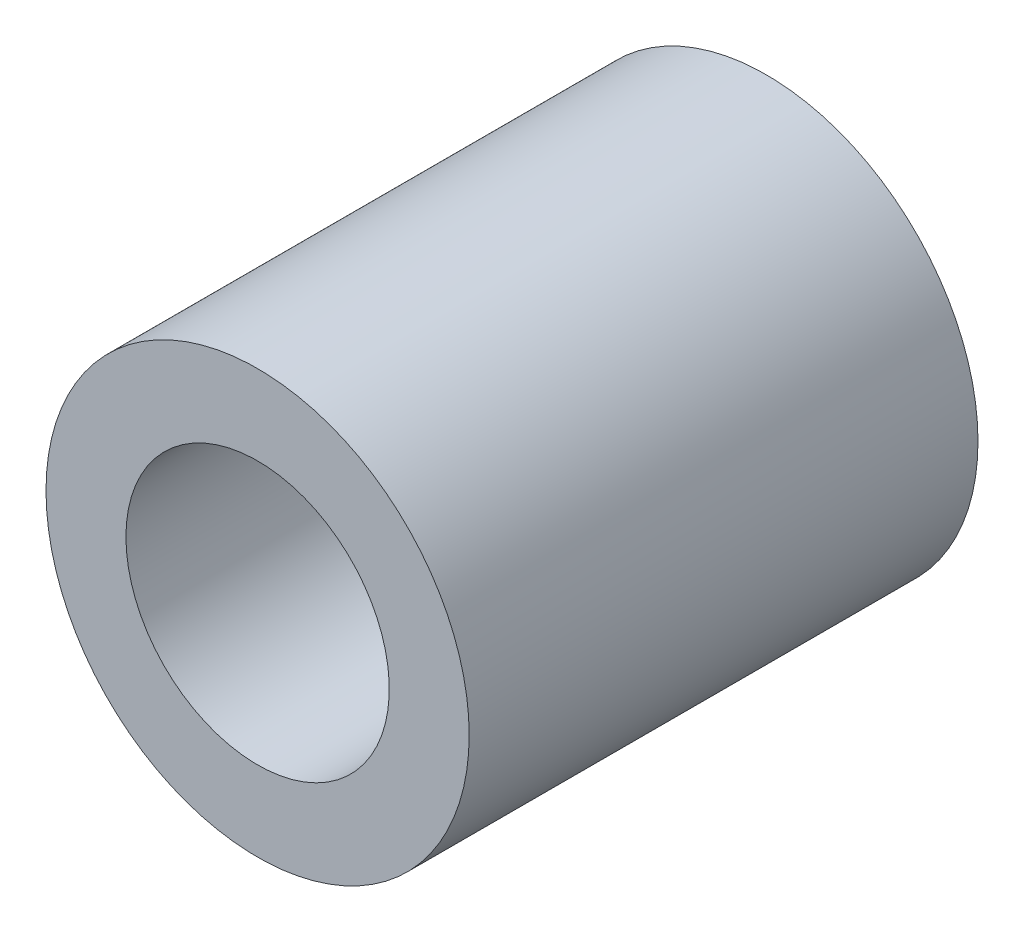
ISO-10303-21;
HEADER;
FILE_DESCRIPTION(('STEP AP214'),'2;1');
FILE_NAME('part.step','',(''),(''),'','','');
FILE_SCHEMA(('AUTOMOTIVE_DESIGN { 1 0 10303 214 1 1 1 1 }'));
ENDSEC;
DATA;
#1=APPLICATION_CONTEXT('core data for automotive mechanical design processes');
#2=APPLICATION_PROTOCOL_DEFINITION('international standard','automotive_design',2000,#1);
#3=PRODUCT_CONTEXT('',#1,'mechanical');
#4=PRODUCT('Part','Part','',(#3));
#5=PRODUCT_RELATED_PRODUCT_CATEGORY('part','',(#4));
#6=PRODUCT_DEFINITION_FORMATION('','',#4);
#7=PRODUCT_DEFINITION_CONTEXT('part definition',#1,'design');
#8=PRODUCT_DEFINITION('design','',#6,#7);
#9=PRODUCT_DEFINITION_SHAPE('','',#8);
#10=(LENGTH_UNIT() NAMED_UNIT(*) SI_UNIT(.MILLI.,.METRE.));
#11=(NAMED_UNIT(*) PLANE_ANGLE_UNIT() SI_UNIT($,.RADIAN.));
#12=(NAMED_UNIT(*) SI_UNIT($,.STERADIAN.) SOLID_ANGLE_UNIT());
#13=UNCERTAINTY_MEASURE_WITH_UNIT(LENGTH_MEASURE(1.E-05),#10,'distance_accuracy_value','');
#14=(GEOMETRIC_REPRESENTATION_CONTEXT(3) GLOBAL_UNCERTAINTY_ASSIGNED_CONTEXT((#13)) GLOBAL_UNIT_ASSIGNED_CONTEXT((#10,
#11,#12)) REPRESENTATION_CONTEXT('',''));
#15=CARTESIAN_POINT('',(0.,0.,0.));
#16=DIRECTION('',(0.,0.,1.));
#17=DIRECTION('',(1.,0.,0.));
#18=AXIS2_PLACEMENT_3D('',#15,#16,#17);
#19=CARTESIAN_POINT('',(0.,0.,9.61875));
#20=DIRECTION('',(0.,0.,-1.));
#21=DIRECTION('',(-1.,0.,0.));
#22=AXIS2_PLACEMENT_3D('',#19,#20,#21);
#23=CYLINDRICAL_SURFACE('',#22,4.);
#24=CARTESIAN_POINT('',(0.,0.,9.61875));
#25=DIRECTION('',(0.,0.,1.));
#26=DIRECTION('',(1.,0.,0.));
#27=AXIS2_PLACEMENT_3D('',#24,#25,#26);
#28=CIRCLE('',#27,4.);
#29=CARTESIAN_POINT('',(4.,0.,9.61875));
#30=VERTEX_POINT('',#29);
#31=EDGE_CURVE('E10',#30,#30,#28,.T.);
#32=ORIENTED_EDGE('',*,*,#31,.F.);
#33=EDGE_LOOP('',(#32));
#34=FACE_BOUND('',#33,.T.);
#35=CARTESIAN_POINT('',(0.,0.,0.));
#36=DIRECTION('',(0.,0.,1.));
#37=DIRECTION('',(1.,0.,0.));
#38=AXIS2_PLACEMENT_3D('',#35,#36,#37);
#39=CIRCLE('',#38,4.);
#40=CARTESIAN_POINT('',(4.,0.,0.));
#41=VERTEX_POINT('',#40);
#42=EDGE_CURVE('E40',#41,#41,#39,.T.);
#43=ORIENTED_EDGE('',*,*,#42,.T.);
#44=EDGE_LOOP('',(#43));
#45=FACE_BOUND('',#44,.T.);
#46=ADVANCED_FACE('F37',(#34,#45),#23,.T.);
#47=CARTESIAN_POINT('',(0.,0.,9.61875));
#48=DIRECTION('',(0.,0.,1.));
#49=DIRECTION('',(1.,0.,0.));
#50=AXIS2_PLACEMENT_3D('',#47,#48,#49);
#51=PLANE('',#50);
#52=CARTESIAN_POINT('',(0.,0.,9.61875));
#53=DIRECTION('',(0.,0.,-1.));
#54=DIRECTION('',(-1.,0.,0.));
#55=AXIS2_PLACEMENT_3D('',#52,#53,#54);
#56=CIRCLE('',#55,2.4892);
#57=CARTESIAN_POINT('',(-2.4892,0.,9.61875));
#58=VERTEX_POINT('',#57);
#59=EDGE_CURVE('E47',#58,#58,#56,.T.);
#60=ORIENTED_EDGE('',*,*,#59,.T.);
#61=EDGE_LOOP('',(#60));
#62=FACE_BOUND('',#61,.T.);
#63=ORIENTED_EDGE('',*,*,#31,.T.);
#64=EDGE_LOOP('',(#63));
#65=FACE_BOUND('',#64,.T.);
#66=ADVANCED_FACE('F60',(#62,#65),#51,.T.);
#67=CARTESIAN_POINT('',(0.,0.,0.));
#68=DIRECTION('',(0.,0.,1.));
#69=DIRECTION('',(1.,0.,0.));
#70=AXIS2_PLACEMENT_3D('',#67,#68,#69);
#71=PLANE('',#70);
#72=CARTESIAN_POINT('',(0.,0.,0.));
#73=DIRECTION('',(0.,0.,-1.));
#74=DIRECTION('',(-1.,0.,0.));
#75=AXIS2_PLACEMENT_3D('',#72,#73,#74);
#76=CIRCLE('',#75,2.48919999999999);
#77=CARTESIAN_POINT('',(-2.48919999999999,0.,0.));
#78=VERTEX_POINT('',#77);
#79=EDGE_CURVE('E51',#78,#78,#76,.T.);
#80=ORIENTED_EDGE('',*,*,#79,.F.);
#81=EDGE_LOOP('',(#80));
#82=FACE_BOUND('',#81,.T.);
#83=ORIENTED_EDGE('',*,*,#42,.F.);
#84=EDGE_LOOP('',(#83));
#85=FACE_BOUND('',#84,.T.);
#86=ADVANCED_FACE('F57',(#82,#85),#71,.F.);
#87=CARTESIAN_POINT('',(0.,0.,0.));
#88=DIRECTION('',(0.,0.,-1.));
#89=DIRECTION('',(-1.,0.,0.));
#90=AXIS2_PLACEMENT_3D('',#87,#88,#89);
#91=CYLINDRICAL_SURFACE('',#90,2.48919999999999);
#92=ORIENTED_EDGE('',*,*,#59,.F.);
#93=EDGE_LOOP('',(#92));
#94=FACE_BOUND('',#93,.T.);
#95=ORIENTED_EDGE('',*,*,#79,.T.);
#96=EDGE_LOOP('',(#95));
#97=FACE_BOUND('',#96,.T.);
#98=ADVANCED_FACE('F55',(#94,#97),#91,.F.);
#99=CLOSED_SHELL('',(#46,#66,#86,#98));
#100=MANIFOLD_SOLID_BREP('B2',#99);
#101=ADVANCED_BREP_SHAPE_REPRESENTATION('',(#18,#100),#14);
#102=SHAPE_DEFINITION_REPRESENTATION(#9,#101);
ENDSEC;
END-ISO-10303-21;
